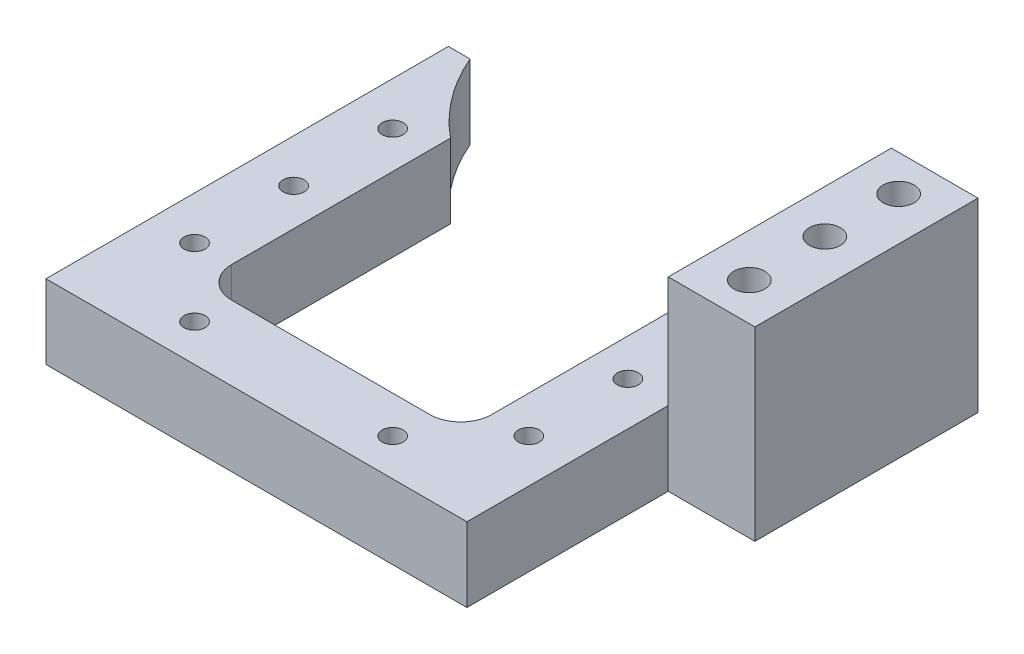
ISO-10303-21;
HEADER;
FILE_DESCRIPTION(('STEP AP214'),'2;1');
FILE_NAME('part.step','',(''),(''),'','','');
FILE_SCHEMA(('AUTOMOTIVE_DESIGN { 1 0 10303 214 1 1 1 1 }'));
ENDSEC;
DATA;
#1=APPLICATION_CONTEXT('core data for automotive mechanical design processes');
#2=APPLICATION_PROTOCOL_DEFINITION('international standard','automotive_design',2000,#1);
#3=PRODUCT_CONTEXT('',#1,'mechanical');
#4=PRODUCT('Part','Part','',(#3));
#5=PRODUCT_RELATED_PRODUCT_CATEGORY('part','',(#4));
#6=PRODUCT_DEFINITION_FORMATION('','',#4);
#7=PRODUCT_DEFINITION_CONTEXT('part definition',#1,'design');
#8=PRODUCT_DEFINITION('design','',#6,#7);
#9=PRODUCT_DEFINITION_SHAPE('','',#8);
#10=(LENGTH_UNIT() NAMED_UNIT(*) SI_UNIT(.MILLI.,.METRE.));
#11=(NAMED_UNIT(*) PLANE_ANGLE_UNIT() SI_UNIT($,.RADIAN.));
#12=(NAMED_UNIT(*) SI_UNIT($,.STERADIAN.) SOLID_ANGLE_UNIT());
#13=UNCERTAINTY_MEASURE_WITH_UNIT(LENGTH_MEASURE(1.E-05),#10,'distance_accuracy_value','');
#14=(GEOMETRIC_REPRESENTATION_CONTEXT(3) GLOBAL_UNCERTAINTY_ASSIGNED_CONTEXT((#13)) GLOBAL_UNIT_ASSIGNED_CONTEXT((#10,
#11,#12)) REPRESENTATION_CONTEXT('',''));
#15=CARTESIAN_POINT('',(0.,0.,0.));
#16=DIRECTION('',(0.,0.,1.));
#17=DIRECTION('',(1.,0.,0.));
#18=AXIS2_PLACEMENT_3D('',#15,#16,#17);
#19=CARTESIAN_POINT('',(17.,6.,6.5));
#20=DIRECTION('',(-1.,0.,0.));
#21=DIRECTION('',(0.,0.,1.));
#22=AXIS2_PLACEMENT_3D('',#19,#20,#21);
#23=PLANE('',#22);
#24=DIRECTION('',(0.,-1.,0.));
#25=VECTOR('',#24,1.);
#26=CARTESIAN_POINT('',(17.,15.,22.74));
#27=LINE('',#26,#25);
#28=CARTESIAN_POINT('',(17.,6.,22.74));
#29=VERTEX_POINT('',#28);
#30=CARTESIAN_POINT('',(17.,0.,22.74));
#31=VERTEX_POINT('',#30);
#32=EDGE_CURVE('E11',#29,#31,#27,.T.);
#33=ORIENTED_EDGE('',*,*,#32,.F.);
#34=DIRECTION('',(0.,0.,-1.));
#35=VECTOR('',#34,1.);
#36=CARTESIAN_POINT('',(17.,6.,33.5));
#37=LINE('',#36,#35);
#38=CARTESIAN_POINT('',(17.,6.,39.));
#39=VERTEX_POINT('',#38);
#40=EDGE_CURVE('E165',#39,#29,#37,.T.);
#41=ORIENTED_EDGE('',*,*,#40,.F.);
#42=DIRECTION('',(0.,-1.,0.));
#43=VECTOR('',#42,1.);
#44=CARTESIAN_POINT('',(17.,6.,39.));
#45=LINE('',#44,#43);
#46=CARTESIAN_POINT('',(17.,0.,39.));
#47=VERTEX_POINT('',#46);
#48=EDGE_CURVE('E318',#39,#47,#45,.T.);
#49=ORIENTED_EDGE('',*,*,#48,.T.);
#50=DIRECTION('',(0.,0.,-1.));
#51=VECTOR('',#50,1.);
#52=CARTESIAN_POINT('',(17.,0.,6.5));
#53=LINE('',#52,#51);
#54=EDGE_CURVE('E243',#47,#31,#53,.T.);
#55=ORIENTED_EDGE('',*,*,#54,.T.);
#56=EDGE_LOOP('',(#33,#41,#49,#55));
#57=FACE_BOUND('',#56,.T.);
#58=ADVANCED_FACE('F33',(#57),#23,.F.);
#59=CARTESIAN_POINT('',(0.,6.,0.));
#60=DIRECTION('',(0.,1.,0.));
#61=DIRECTION('',(0.,0.,1.));
#62=AXIS2_PLACEMENT_3D('',#59,#60,#61);
#63=PLANE('',#62);
#64=CARTESIAN_POINT('',(-8.,6.,30.5));
#65=DIRECTION('',(0.,1.,0.));
#66=DIRECTION('',(0.,0.,1.));
#67=AXIS2_PLACEMENT_3D('',#64,#65,#66);
#68=CIRCLE('',#67,2.49999999999999);
#69=CARTESIAN_POINT('',(-10.5,6.,30.5));
#70=VERTEX_POINT('',#69);
#71=CARTESIAN_POINT('',(-8.,6.,33.));
#72=VERTEX_POINT('',#71);
#73=EDGE_CURVE('E190',#70,#72,#68,.T.);
#74=ORIENTED_EDGE('',*,*,#73,.F.);
#75=DIRECTION('',(0.,0.,-1.));
#76=VECTOR('',#75,1.);
#77=CARTESIAN_POINT('',(-10.5,6.,12.8281916106675));
#78=LINE('',#77,#76);
#79=CARTESIAN_POINT('',(-10.5,6.,12.8281916106675));
#80=VERTEX_POINT('',#79);
#81=EDGE_CURVE('E371',#70,#80,#78,.T.);
#82=ORIENTED_EDGE('',*,*,#81,.T.);
#83=CARTESIAN_POINT('',(0.,6.,0.));
#84=DIRECTION('',(0.,-1.,0.));
#85=DIRECTION('',(0.,0.,1.));
#86=AXIS2_PLACEMENT_3D('',#83,#84,#85);
#87=CIRCLE('',#86,16.5774696501004);
#88=CARTESIAN_POINT('',(-15.25,6.,6.5));
#89=VERTEX_POINT('',#88);
#90=EDGE_CURVE('E341',#80,#89,#87,.T.);
#91=ORIENTED_EDGE('',*,*,#90,.T.);
#92=DIRECTION('',(-1.,0.,0.));
#93=VECTOR('',#92,1.);
#94=CARTESIAN_POINT('',(-17.,6.,6.5));
#95=LINE('',#94,#93);
#96=CARTESIAN_POINT('',(-17.,6.,6.5));
#97=VERTEX_POINT('',#96);
#98=EDGE_CURVE('E336',#89,#97,#95,.T.);
#99=ORIENTED_EDGE('',*,*,#98,.T.);
#100=DIRECTION('',(0.,0.,1.));
#101=VECTOR('',#100,1.);
#102=CARTESIAN_POINT('',(-17.,6.,6.5));
#103=LINE('',#102,#101);
#104=CARTESIAN_POINT('',(-17.,6.,39.));
#105=VERTEX_POINT('',#104);
#106=EDGE_CURVE('E387',#97,#105,#103,.T.);
#107=ORIENTED_EDGE('',*,*,#106,.T.);
#108=DIRECTION('',(1.,0.,0.));
#109=VECTOR('',#108,1.);
#110=CARTESIAN_POINT('',(-17.,6.,39.));
#111=LINE('',#110,#109);
#112=EDGE_CURVE('E168',#105,#39,#111,.T.);
#113=ORIENTED_EDGE('',*,*,#112,.T.);
#114=ORIENTED_EDGE('',*,*,#40,.T.);
#115=CARTESIAN_POINT('',(17.,6.,4.72231154390292));
#116=VERTEX_POINT('',#115);
#117=EDGE_CURVE('E159',#29,#116,#37,.T.);
#118=ORIENTED_EDGE('',*,*,#117,.T.);
#119=DIRECTION('',(-1.,0.,0.));
#120=VECTOR('',#119,1.);
#121=CARTESIAN_POINT('',(17.,6.,4.72231154390292));
#122=LINE('',#121,#120);
#123=CARTESIAN_POINT('',(15.25,6.,4.72231154390292));
#124=VERTEX_POINT('',#123);
#125=EDGE_CURVE('E164',#116,#124,#122,.T.);
#126=ORIENTED_EDGE('',*,*,#125,.T.);
#127=DIRECTION('',(0.,0.,1.));
#128=VECTOR('',#127,1.);
#129=CARTESIAN_POINT('',(15.25,6.,4.72231154390292));
#130=LINE('',#129,#128);
#131=CARTESIAN_POINT('',(15.25,6.,6.5));
#132=VERTEX_POINT('',#131);
#133=EDGE_CURVE('E174',#124,#132,#130,.T.);
#134=ORIENTED_EDGE('',*,*,#133,.T.);
#135=CARTESIAN_POINT('',(0.,6.,0.));
#136=DIRECTION('',(0.,-1.,0.));
#137=DIRECTION('',(0.,0.,-1.));
#138=AXIS2_PLACEMENT_3D('',#135,#136,#137);
#139=CIRCLE('',#138,16.5774696501004);
#140=CARTESIAN_POINT('',(10.5,6.,12.8281916106675));
#141=VERTEX_POINT('',#140);
#142=EDGE_CURVE('E360',#132,#141,#139,.T.);
#143=ORIENTED_EDGE('',*,*,#142,.T.);
#144=DIRECTION('',(0.,0.,1.));
#145=VECTOR('',#144,1.);
#146=CARTESIAN_POINT('',(10.5,6.,12.8281916106675));
#147=LINE('',#146,#145);
#148=CARTESIAN_POINT('',(10.5,6.,30.5));
#149=VERTEX_POINT('',#148);
#150=EDGE_CURVE('E361',#141,#149,#147,.T.);
#151=ORIENTED_EDGE('',*,*,#150,.T.);
#152=CARTESIAN_POINT('',(8.,6.,30.5));
#153=DIRECTION('',(0.,1.,0.));
#154=DIRECTION('',(0.,0.,1.));
#155=AXIS2_PLACEMENT_3D('',#152,#153,#154);
#156=CIRCLE('',#155,2.49999999999999);
#157=CARTESIAN_POINT('',(8.,6.,33.));
#158=VERTEX_POINT('',#157);
#159=EDGE_CURVE('E192',#158,#149,#156,.T.);
#160=ORIENTED_EDGE('',*,*,#159,.F.);
#161=DIRECTION('',(-1.,0.,0.));
#162=VECTOR('',#161,1.);
#163=CARTESIAN_POINT('',(8.,6.,33.));
#164=LINE('',#163,#162);
#165=EDGE_CURVE('E368',#158,#72,#164,.T.);
#166=ORIENTED_EDGE('',*,*,#165,.T.);
#167=EDGE_LOOP('',(#74,#82,#91,#99,#107,#113,#114,#118,#126,#134,#143,#151,#160,#166));
#168=FACE_BOUND('',#167,.T.);
#169=CARTESIAN_POINT('',(13.5,6.,22.5));
#170=DIRECTION('',(0.,1.,0.));
#171=DIRECTION('',(0.,0.,1.));
#172=AXIS2_PLACEMENT_3D('',#169,#170,#171);
#173=CIRCLE('',#172,0.85);
#174=CARTESIAN_POINT('',(13.5,6.,23.35));
#175=VERTEX_POINT('',#174);
#176=EDGE_CURVE('E482',#175,#175,#173,.T.);
#177=ORIENTED_EDGE('',*,*,#176,.F.);
#178=EDGE_LOOP('',(#177));
#179=FACE_BOUND('',#178,.T.);
#180=CARTESIAN_POINT('',(8.,6.,36.));
#181=DIRECTION('',(0.,1.,0.));
#182=DIRECTION('',(0.,0.,1.));
#183=AXIS2_PLACEMENT_3D('',#180,#181,#182);
#184=CIRCLE('',#183,0.850000000000001);
#185=CARTESIAN_POINT('',(8.,6.,36.85));
#186=VERTEX_POINT('',#185);
#187=EDGE_CURVE('E490',#186,#186,#184,.T.);
#188=ORIENTED_EDGE('',*,*,#187,.F.);
#189=EDGE_LOOP('',(#188));
#190=FACE_BOUND('',#189,.T.);
#191=CARTESIAN_POINT('',(-13.5,6.,14.5));
#192=DIRECTION('',(0.,1.,0.));
#193=DIRECTION('',(0.,0.,1.));
#194=AXIS2_PLACEMENT_3D('',#191,#192,#193);
#195=CIRCLE('',#194,0.85);
#196=CARTESIAN_POINT('',(-13.5,6.,15.35));
#197=VERTEX_POINT('',#196);
#198=EDGE_CURVE('E498',#197,#197,#195,.T.);
#199=ORIENTED_EDGE('',*,*,#198,.F.);
#200=EDGE_LOOP('',(#199));
#201=FACE_BOUND('',#200,.T.);
#202=CARTESIAN_POINT('',(-13.5,6.,30.5));
#203=DIRECTION('',(0.,1.,0.));
#204=DIRECTION('',(0.,0.,1.));
#205=AXIS2_PLACEMENT_3D('',#202,#203,#204);
#206=CIRCLE('',#205,0.85);
#207=CARTESIAN_POINT('',(-13.5,6.,31.35));
#208=VERTEX_POINT('',#207);
#209=EDGE_CURVE('E373',#208,#208,#206,.T.);
#210=ORIENTED_EDGE('',*,*,#209,.F.);
#211=EDGE_LOOP('',(#210));
#212=FACE_BOUND('',#211,.T.);
#213=CARTESIAN_POINT('',(-13.5,6.,22.5));
#214=DIRECTION('',(0.,1.,0.));
#215=DIRECTION('',(0.,0.,1.));
#216=AXIS2_PLACEMENT_3D('',#213,#214,#215);
#217=CIRCLE('',#216,0.85);
#218=CARTESIAN_POINT('',(-13.5,6.,23.35));
#219=VERTEX_POINT('',#218);
#220=EDGE_CURVE('E380',#219,#219,#217,.T.);
#221=ORIENTED_EDGE('',*,*,#220,.F.);
#222=EDGE_LOOP('',(#221));
#223=FACE_BOUND('',#222,.T.);
#224=CARTESIAN_POINT('',(-8.,6.,36.));
#225=DIRECTION('',(0.,1.,0.));
#226=DIRECTION('',(0.,0.,1.));
#227=AXIS2_PLACEMENT_3D('',#224,#225,#226);
#228=CIRCLE('',#227,0.850000000000002);
#229=CARTESIAN_POINT('',(-8.,6.,36.85));
#230=VERTEX_POINT('',#229);
#231=EDGE_CURVE('E494',#230,#230,#228,.T.);
#232=ORIENTED_EDGE('',*,*,#231,.F.);
#233=EDGE_LOOP('',(#232));
#234=FACE_BOUND('',#233,.T.);
#235=CARTESIAN_POINT('',(13.5,6.,30.5));
#236=DIRECTION('',(0.,1.,0.));
#237=DIRECTION('',(0.,0.,1.));
#238=AXIS2_PLACEMENT_3D('',#235,#236,#237);
#239=CIRCLE('',#238,0.85);
#240=CARTESIAN_POINT('',(13.5,6.,31.35));
#241=VERTEX_POINT('',#240);
#242=EDGE_CURVE('E486',#241,#241,#239,.T.);
#243=ORIENTED_EDGE('',*,*,#242,.F.);
#244=EDGE_LOOP('',(#243));
#245=FACE_BOUND('',#244,.T.);
#246=CARTESIAN_POINT('',(13.5,6.,14.5));
#247=DIRECTION('',(0.,1.,0.));
#248=DIRECTION('',(0.,0.,1.));
#249=AXIS2_PLACEMENT_3D('',#246,#247,#248);
#250=CIRCLE('',#249,0.85);
#251=CARTESIAN_POINT('',(13.5,6.,15.35));
#252=VERTEX_POINT('',#251);
#253=EDGE_CURVE('E478',#252,#252,#250,.T.);
#254=ORIENTED_EDGE('',*,*,#253,.F.);
#255=EDGE_LOOP('',(#254));
#256=FACE_BOUND('',#255,.T.);
#257=ADVANCED_FACE('F161',(#168,#179,#190,#201,#212,#223,#234,#245,#256),#63,.T.);
#258=CARTESIAN_POINT('',(0.,0.,0.));
#259=DIRECTION('',(0.,1.,0.));
#260=DIRECTION('',(0.,0.,1.));
#261=AXIS2_PLACEMENT_3D('',#258,#259,#260);
#262=PLANE('',#261);
#263=CARTESIAN_POINT('',(0.,0.,0.));
#264=DIRECTION('',(0.,-1.,0.));
#265=DIRECTION('',(0.,0.,-1.));
#266=AXIS2_PLACEMENT_3D('',#263,#264,#265);
#267=CIRCLE('',#266,16.5774696501004);
#268=CARTESIAN_POINT('',(15.25,0.,6.5));
#269=VERTEX_POINT('',#268);
#270=CARTESIAN_POINT('',(10.5,0.,12.8281916106675));
#271=VERTEX_POINT('',#270);
#272=EDGE_CURVE('E321',#269,#271,#267,.T.);
#273=ORIENTED_EDGE('',*,*,#272,.F.);
#274=DIRECTION('',(0.,0.,-1.));
#275=VECTOR('',#274,1.);
#276=CARTESIAN_POINT('',(15.25,0.,4.72231154390292));
#277=LINE('',#276,#275);
#278=CARTESIAN_POINT('',(15.25,0.,4.72231154390292));
#279=VERTEX_POINT('',#278);
#280=EDGE_CURVE('E180',#269,#279,#277,.T.);
#281=ORIENTED_EDGE('',*,*,#280,.T.);
#282=DIRECTION('',(1.,0.,0.));
#283=VECTOR('',#282,1.);
#284=CARTESIAN_POINT('',(17.,0.,4.72231154390292));
#285=LINE('',#284,#283);
#286=CARTESIAN_POINT('',(17.,0.,4.72231154390292));
#287=VERTEX_POINT('',#286);
#288=EDGE_CURVE('E184',#279,#287,#285,.T.);
#289=ORIENTED_EDGE('',*,*,#288,.T.);
#290=DIRECTION('',(0.,0.,-1.));
#291=VECTOR('',#290,1.);
#292=CARTESIAN_POINT('',(17.,0.,4.72));
#293=LINE('',#292,#291);
#294=CARTESIAN_POINT('',(17.,0.,4.72));
#295=VERTEX_POINT('',#294);
#296=EDGE_CURVE('E37',#287,#295,#293,.T.);
#297=ORIENTED_EDGE('',*,*,#296,.T.);
#298=DIRECTION('',(1.,0.,0.));
#299=VECTOR('',#298,1.);
#300=CARTESIAN_POINT('',(24.,0.,4.72));
#301=LINE('',#300,#299);
#302=CARTESIAN_POINT('',(24.,0.,4.72));
#303=VERTEX_POINT('',#302);
#304=EDGE_CURVE('E217',#295,#303,#301,.T.);
#305=ORIENTED_EDGE('',*,*,#304,.T.);
#306=DIRECTION('',(0.,0.,1.));
#307=VECTOR('',#306,1.);
#308=CARTESIAN_POINT('',(24.,0.,22.74));
#309=LINE('',#308,#307);
#310=CARTESIAN_POINT('',(24.,0.,22.74));
#311=VERTEX_POINT('',#310);
#312=EDGE_CURVE('E210',#303,#311,#309,.T.);
#313=ORIENTED_EDGE('',*,*,#312,.T.);
#314=DIRECTION('',(-1.,0.,0.));
#315=VECTOR('',#314,1.);
#316=CARTESIAN_POINT('',(17.,0.,22.74));
#317=LINE('',#316,#315);
#318=EDGE_CURVE('E227',#311,#31,#317,.T.);
#319=ORIENTED_EDGE('',*,*,#318,.T.);
#320=ORIENTED_EDGE('',*,*,#54,.F.);
#321=DIRECTION('',(1.,0.,0.));
#322=VECTOR('',#321,1.);
#323=CARTESIAN_POINT('',(-17.,0.,39.));
#324=LINE('',#323,#322);
#325=CARTESIAN_POINT('',(-17.,0.,39.));
#326=VERTEX_POINT('',#325);
#327=EDGE_CURVE('E312',#326,#47,#324,.T.);
#328=ORIENTED_EDGE('',*,*,#327,.F.);
#329=DIRECTION('',(0.,0.,1.));
#330=VECTOR('',#329,1.);
#331=CARTESIAN_POINT('',(-17.,0.,33.5));
#332=LINE('',#331,#330);
#333=CARTESIAN_POINT('',(-17.,0.,6.5));
#334=VERTEX_POINT('',#333);
#335=EDGE_CURVE('E304',#334,#326,#332,.T.);
#336=ORIENTED_EDGE('',*,*,#335,.F.);
#337=DIRECTION('',(-1.,0.,0.));
#338=VECTOR('',#337,1.);
#339=CARTESIAN_POINT('',(-17.,0.,6.5));
#340=LINE('',#339,#338);
#341=CARTESIAN_POINT('',(-15.25,0.,6.5));
#342=VERTEX_POINT('',#341);
#343=EDGE_CURVE('E313',#342,#334,#340,.T.);
#344=ORIENTED_EDGE('',*,*,#343,.F.);
#345=CARTESIAN_POINT('',(0.,0.,0.));
#346=DIRECTION('',(0.,-1.,0.));
#347=DIRECTION('',(0.,0.,1.));
#348=AXIS2_PLACEMENT_3D('',#345,#346,#347);
#349=CIRCLE('',#348,16.5774696501004);
#350=CARTESIAN_POINT('',(-10.5,0.,12.8281916106675));
#351=VERTEX_POINT('',#350);
#352=EDGE_CURVE('E334',#351,#342,#349,.T.);
#353=ORIENTED_EDGE('',*,*,#352,.F.);
#354=DIRECTION('',(0.,0.,-1.));
#355=VECTOR('',#354,1.);
#356=CARTESIAN_POINT('',(-10.5,0.,12.8281916106675));
#357=LINE('',#356,#355);
#358=CARTESIAN_POINT('',(-10.5,0.,30.5));
#359=VERTEX_POINT('',#358);
#360=EDGE_CURVE('E332',#359,#351,#357,.T.);
#361=ORIENTED_EDGE('',*,*,#360,.F.);
#362=CARTESIAN_POINT('',(-8.,0.,30.5));
#363=DIRECTION('',(0.,-1.,0.));
#364=DIRECTION('',(0.,0.,-1.));
#365=AXIS2_PLACEMENT_3D('',#362,#363,#364);
#366=CIRCLE('',#365,2.49999999999999);
#367=CARTESIAN_POINT('',(-8.,0.,33.));
#368=VERTEX_POINT('',#367);
#369=EDGE_CURVE('E186',#368,#359,#366,.T.);
#370=ORIENTED_EDGE('',*,*,#369,.F.);
#371=DIRECTION('',(-1.,0.,0.));
#372=VECTOR('',#371,1.);
#373=CARTESIAN_POINT('',(8.,0.,33.));
#374=LINE('',#373,#372);
#375=CARTESIAN_POINT('',(8.,0.,33.));
#376=VERTEX_POINT('',#375);
#377=EDGE_CURVE('E329',#376,#368,#374,.T.);
#378=ORIENTED_EDGE('',*,*,#377,.F.);
#379=CARTESIAN_POINT('',(8.,0.,30.5));
#380=DIRECTION('',(0.,-1.,0.));
#381=DIRECTION('',(0.,0.,-1.));
#382=AXIS2_PLACEMENT_3D('',#379,#380,#381);
#383=CIRCLE('',#382,2.49999999999999);
#384=CARTESIAN_POINT('',(10.5,0.,30.5));
#385=VERTEX_POINT('',#384);
#386=EDGE_CURVE('E188',#385,#376,#383,.T.);
#387=ORIENTED_EDGE('',*,*,#386,.F.);
#388=DIRECTION('',(0.,0.,1.));
#389=VECTOR('',#388,1.);
#390=CARTESIAN_POINT('',(10.5,0.,12.8281916106675));
#391=LINE('',#390,#389);
#392=EDGE_CURVE('E326',#271,#385,#391,.T.);
#393=ORIENTED_EDGE('',*,*,#392,.F.);
#394=EDGE_LOOP('',(#273,#281,#289,#297,#305,#313,#319,#320,#328,#336,#344,#353,#361,#370,#378,
#387,#393));
#395=FACE_BOUND('',#394,.T.);
#396=CARTESIAN_POINT('',(20.5,0.,19.69));
#397=DIRECTION('',(0.,-1.,0.));
#398=DIRECTION('',(0.,0.,-1.));
#399=AXIS2_PLACEMENT_3D('',#396,#397,#398);
#400=CIRCLE('',#399,1.25);
#401=CARTESIAN_POINT('',(20.5,0.,18.44));
#402=VERTEX_POINT('',#401);
#403=EDGE_CURVE('E194',#402,#402,#400,.T.);
#404=ORIENTED_EDGE('',*,*,#403,.F.);
#405=EDGE_LOOP('',(#404));
#406=FACE_BOUND('',#405,.T.);
#407=CARTESIAN_POINT('',(20.5,0.,13.59));
#408=DIRECTION('',(0.,-1.,0.));
#409=DIRECTION('',(0.,0.,-1.));
#410=AXIS2_PLACEMENT_3D('',#407,#408,#409);
#411=CIRCLE('',#410,1.25);
#412=CARTESIAN_POINT('',(20.5,0.,12.34));
#413=VERTEX_POINT('',#412);
#414=EDGE_CURVE('E198',#413,#413,#411,.T.);
#415=ORIENTED_EDGE('',*,*,#414,.F.);
#416=EDGE_LOOP('',(#415));
#417=FACE_BOUND('',#416,.T.);
#418=CARTESIAN_POINT('',(20.5,0.,7.63));
#419=DIRECTION('',(0.,-1.,0.));
#420=DIRECTION('',(0.,0.,-1.));
#421=AXIS2_PLACEMENT_3D('',#418,#419,#420);
#422=CIRCLE('',#421,1.25);
#423=CARTESIAN_POINT('',(20.5,0.,6.38));
#424=VERTEX_POINT('',#423);
#425=EDGE_CURVE('E204',#424,#424,#422,.T.);
#426=ORIENTED_EDGE('',*,*,#425,.F.);
#427=EDGE_LOOP('',(#426));
#428=FACE_BOUND('',#427,.T.);
#429=CARTESIAN_POINT('',(-13.5,0.,30.5));
#430=DIRECTION('',(0.,1.,0.));
#431=DIRECTION('',(0.,0.,1.));
#432=AXIS2_PLACEMENT_3D('',#429,#430,#431);
#433=CIRCLE('',#432,0.85);
#434=CARTESIAN_POINT('',(-13.5,0.,31.35));
#435=VERTEX_POINT('',#434);
#436=EDGE_CURVE('E375',#435,#435,#433,.T.);
#437=ORIENTED_EDGE('',*,*,#436,.T.);
#438=EDGE_LOOP('',(#437));
#439=FACE_BOUND('',#438,.T.);
#440=CARTESIAN_POINT('',(-13.5,0.,22.5));
#441=DIRECTION('',(0.,1.,0.));
#442=DIRECTION('',(0.,0.,1.));
#443=AXIS2_PLACEMENT_3D('',#440,#441,#442);
#444=CIRCLE('',#443,0.85);
#445=CARTESIAN_POINT('',(-13.5,0.,23.35));
#446=VERTEX_POINT('',#445);
#447=EDGE_CURVE('E383',#446,#446,#444,.T.);
#448=ORIENTED_EDGE('',*,*,#447,.T.);
#449=EDGE_LOOP('',(#448));
#450=FACE_BOUND('',#449,.T.);
#451=CARTESIAN_POINT('',(-13.5,0.,14.5));
#452=DIRECTION('',(0.,1.,0.));
#453=DIRECTION('',(0.,0.,1.));
#454=AXIS2_PLACEMENT_3D('',#451,#452,#453);
#455=CIRCLE('',#454,0.85);
#456=CARTESIAN_POINT('',(-13.5,0.,15.35));
#457=VERTEX_POINT('',#456);
#458=EDGE_CURVE('E458',#457,#457,#455,.T.);
#459=ORIENTED_EDGE('',*,*,#458,.T.);
#460=EDGE_LOOP('',(#459));
#461=FACE_BOUND('',#460,.T.);
#462=CARTESIAN_POINT('',(-8.,0.,36.));
#463=DIRECTION('',(0.,1.,0.));
#464=DIRECTION('',(0.,0.,1.));
#465=AXIS2_PLACEMENT_3D('',#462,#463,#464);
#466=CIRCLE('',#465,0.850000000000002);
#467=CARTESIAN_POINT('',(-8.,0.,36.85));
#468=VERTEX_POINT('',#467);
#469=EDGE_CURVE('E462',#468,#468,#466,.T.);
#470=ORIENTED_EDGE('',*,*,#469,.T.);
#471=EDGE_LOOP('',(#470));
#472=FACE_BOUND('',#471,.T.);
#473=CARTESIAN_POINT('',(8.,0.,36.));
#474=DIRECTION('',(0.,1.,0.));
#475=DIRECTION('',(0.,0.,1.));
#476=AXIS2_PLACEMENT_3D('',#473,#474,#475);
#477=CIRCLE('',#476,0.850000000000001);
#478=CARTESIAN_POINT('',(8.,0.,36.85));
#479=VERTEX_POINT('',#478);
#480=EDGE_CURVE('E466',#479,#479,#477,.T.);
#481=ORIENTED_EDGE('',*,*,#480,.T.);
#482=EDGE_LOOP('',(#481));
#483=FACE_BOUND('',#482,.T.);
#484=CARTESIAN_POINT('',(13.5,0.,30.5));
#485=DIRECTION('',(0.,1.,0.));
#486=DIRECTION('',(0.,0.,1.));
#487=AXIS2_PLACEMENT_3D('',#484,#485,#486);
#488=CIRCLE('',#487,0.85);
#489=CARTESIAN_POINT('',(13.5,0.,31.35));
#490=VERTEX_POINT('',#489);
#491=EDGE_CURVE('E470',#490,#490,#488,.T.);
#492=ORIENTED_EDGE('',*,*,#491,.T.);
#493=EDGE_LOOP('',(#492));
#494=FACE_BOUND('',#493,.T.);
#495=CARTESIAN_POINT('',(13.5,0.,22.5));
#496=DIRECTION('',(0.,1.,0.));
#497=DIRECTION('',(0.,0.,1.));
#498=AXIS2_PLACEMENT_3D('',#495,#496,#497);
#499=CIRCLE('',#498,0.85);
#500=CARTESIAN_POINT('',(13.5,0.,23.35));
#501=VERTEX_POINT('',#500);
#502=EDGE_CURVE('E474',#501,#501,#499,.T.);
#503=ORIENTED_EDGE('',*,*,#502,.T.);
#504=EDGE_LOOP('',(#503));
#505=FACE_BOUND('',#504,.T.);
#506=CARTESIAN_POINT('',(13.5,0.,14.5));
#507=DIRECTION('',(0.,1.,0.));
#508=DIRECTION('',(0.,0.,1.));
#509=AXIS2_PLACEMENT_3D('',#506,#507,#508);
#510=CIRCLE('',#509,0.85);
#511=CARTESIAN_POINT('',(13.5,0.,15.35));
#512=VERTEX_POINT('',#511);
#513=EDGE_CURVE('E234',#512,#512,#510,.T.);
#514=ORIENTED_EDGE('',*,*,#513,.T.);
#515=EDGE_LOOP('',(#514));
#516=FACE_BOUND('',#515,.T.);
#517=ADVANCED_FACE('F251',(#395,#406,#417,#428,#439,#450,#461,#472,#483,#494,#505,#516),#262,.F.);
#518=CARTESIAN_POINT('',(-17.,6.,6.5));
#519=DIRECTION('',(0.,0.,1.));
#520=DIRECTION('',(1.,0.,0.));
#521=AXIS2_PLACEMENT_3D('',#518,#519,#520);
#522=PLANE('',#521);
#523=ORIENTED_EDGE('',*,*,#343,.T.);
#524=DIRECTION('',(0.,-1.,0.));
#525=VECTOR('',#524,1.);
#526=CARTESIAN_POINT('',(-17.,6.,6.5));
#527=LINE('',#526,#525);
#528=EDGE_CURVE('E43',#97,#334,#527,.T.);
#529=ORIENTED_EDGE('',*,*,#528,.F.);
#530=ORIENTED_EDGE('',*,*,#98,.F.);
#531=DIRECTION('',(0.,-1.,0.));
#532=VECTOR('',#531,1.);
#533=CARTESIAN_POINT('',(-15.25,6.,6.5));
#534=LINE('',#533,#532);
#535=EDGE_CURVE('E337',#89,#342,#534,.T.);
#536=ORIENTED_EDGE('',*,*,#535,.T.);
#537=EDGE_LOOP('',(#523,#529,#530,#536));
#538=FACE_BOUND('',#537,.T.);
#539=ADVANCED_FACE('F35',(#538),#522,.F.);
#540=CARTESIAN_POINT('',(-17.,6.,33.5));
#541=DIRECTION('',(1.,0.,0.));
#542=DIRECTION('',(0.,0.,-1.));
#543=AXIS2_PLACEMENT_3D('',#540,#541,#542);
#544=PLANE('',#543);
#545=ORIENTED_EDGE('',*,*,#335,.T.);
#546=DIRECTION('',(0.,-1.,0.));
#547=VECTOR('',#546,1.);
#548=CARTESIAN_POINT('',(-17.,6.,39.));
#549=LINE('',#548,#547);
#550=EDGE_CURVE('E306',#105,#326,#549,.T.);
#551=ORIENTED_EDGE('',*,*,#550,.F.);
#552=ORIENTED_EDGE('',*,*,#106,.F.);
#553=ORIENTED_EDGE('',*,*,#528,.T.);
#554=EDGE_LOOP('',(#545,#551,#552,#553));
#555=FACE_BOUND('',#554,.T.);
#556=ADVANCED_FACE('F294',(#555),#544,.F.);
#557=CARTESIAN_POINT('',(-17.,6.,39.));
#558=DIRECTION('',(0.,0.,-1.));
#559=DIRECTION('',(-1.,0.,0.));
#560=AXIS2_PLACEMENT_3D('',#557,#558,#559);
#561=PLANE('',#560);
#562=ORIENTED_EDGE('',*,*,#327,.T.);
#563=ORIENTED_EDGE('',*,*,#48,.F.);
#564=ORIENTED_EDGE('',*,*,#112,.F.);
#565=ORIENTED_EDGE('',*,*,#550,.T.);
#566=EDGE_LOOP('',(#562,#563,#564,#565));
#567=FACE_BOUND('',#566,.T.);
#568=ADVANCED_FACE('F292',(#567),#561,.F.);
#569=CARTESIAN_POINT('',(0.,6.,0.));
#570=DIRECTION('',(0.,-1.,0.));
#571=DIRECTION('',(0.,0.,-1.));
#572=AXIS2_PLACEMENT_3D('',#569,#570,#571);
#573=CYLINDRICAL_SURFACE('',#572,16.5774696501004);
#574=ORIENTED_EDGE('',*,*,#272,.T.);
#575=DIRECTION('',(0.,-1.,0.));
#576=VECTOR('',#575,1.);
#577=CARTESIAN_POINT('',(10.5,6.,12.8281916106675));
#578=LINE('',#577,#576);
#579=EDGE_CURVE('E354',#141,#271,#578,.T.);
#580=ORIENTED_EDGE('',*,*,#579,.F.);
#581=ORIENTED_EDGE('',*,*,#142,.F.);
#582=DIRECTION('',(0.,-1.,0.));
#583=VECTOR('',#582,1.);
#584=CARTESIAN_POINT('',(15.25,6.,6.5));
#585=LINE('',#584,#583);
#586=EDGE_CURVE('E357',#132,#269,#585,.T.);
#587=ORIENTED_EDGE('',*,*,#586,.T.);
#588=EDGE_LOOP('',(#574,#580,#581,#587));
#589=FACE_BOUND('',#588,.T.);
#590=ADVANCED_FACE('F290',(#589),#573,.F.);
#591=CARTESIAN_POINT('',(10.5,6.,12.8281916106675));
#592=DIRECTION('',(1.,0.,0.));
#593=DIRECTION('',(0.,0.,-1.));
#594=AXIS2_PLACEMENT_3D('',#591,#592,#593);
#595=PLANE('',#594);
#596=ORIENTED_EDGE('',*,*,#392,.T.);
#597=DIRECTION('',(0.,-1.,0.));
#598=VECTOR('',#597,1.);
#599=CARTESIAN_POINT('',(10.5,6.,30.5));
#600=LINE('',#599,#598);
#601=EDGE_CURVE('E352',#149,#385,#600,.T.);
#602=ORIENTED_EDGE('',*,*,#601,.F.);
#603=ORIENTED_EDGE('',*,*,#150,.F.);
#604=ORIENTED_EDGE('',*,*,#579,.T.);
#605=EDGE_LOOP('',(#596,#602,#603,#604));
#606=FACE_BOUND('',#605,.T.);
#607=ADVANCED_FACE('F413',(#606),#595,.F.);
#608=CARTESIAN_POINT('',(8.,6.,33.));
#609=DIRECTION('',(0.,0.,1.));
#610=DIRECTION('',(1.,0.,0.));
#611=AXIS2_PLACEMENT_3D('',#608,#609,#610);
#612=PLANE('',#611);
#613=ORIENTED_EDGE('',*,*,#377,.T.);
#614=DIRECTION('',(0.,-1.,0.));
#615=VECTOR('',#614,1.);
#616=CARTESIAN_POINT('',(-8.,6.,33.));
#617=LINE('',#616,#615);
#618=EDGE_CURVE('E347',#72,#368,#617,.T.);
#619=ORIENTED_EDGE('',*,*,#618,.F.);
#620=ORIENTED_EDGE('',*,*,#165,.F.);
#621=DIRECTION('',(0.,-1.,0.));
#622=VECTOR('',#621,1.);
#623=CARTESIAN_POINT('',(8.,6.,33.));
#624=LINE('',#623,#622);
#625=EDGE_CURVE('E349',#158,#376,#624,.T.);
#626=ORIENTED_EDGE('',*,*,#625,.T.);
#627=EDGE_LOOP('',(#613,#619,#620,#626));
#628=FACE_BOUND('',#627,.T.);
#629=ADVANCED_FACE('F406',(#628),#612,.F.);
#630=CARTESIAN_POINT('',(-10.5,6.,12.8281916106675));
#631=DIRECTION('',(-1.,0.,0.));
#632=DIRECTION('',(0.,0.,1.));
#633=AXIS2_PLACEMENT_3D('',#630,#631,#632);
#634=PLANE('',#633);
#635=ORIENTED_EDGE('',*,*,#360,.T.);
#636=DIRECTION('',(0.,-1.,0.));
#637=VECTOR('',#636,1.);
#638=CARTESIAN_POINT('',(-10.5,6.,12.8281916106675));
#639=LINE('',#638,#637);
#640=EDGE_CURVE('E340',#80,#351,#639,.T.);
#641=ORIENTED_EDGE('',*,*,#640,.F.);
#642=ORIENTED_EDGE('',*,*,#81,.F.);
#643=DIRECTION('',(0.,-1.,0.));
#644=VECTOR('',#643,1.);
#645=CARTESIAN_POINT('',(-10.5,6.,30.5));
#646=LINE('',#645,#644);
#647=EDGE_CURVE('E344',#70,#359,#646,.T.);
#648=ORIENTED_EDGE('',*,*,#647,.T.);
#649=EDGE_LOOP('',(#635,#641,#642,#648));
#650=FACE_BOUND('',#649,.T.);
#651=ADVANCED_FACE('F399',(#650),#634,.F.);
#652=CARTESIAN_POINT('',(0.,6.,0.));
#653=DIRECTION('',(0.,-1.,0.));
#654=DIRECTION('',(0.,0.,-1.));
#655=AXIS2_PLACEMENT_3D('',#652,#653,#654);
#656=CYLINDRICAL_SURFACE('',#655,16.5774696501004);
#657=ORIENTED_EDGE('',*,*,#352,.T.);
#658=ORIENTED_EDGE('',*,*,#535,.F.);
#659=ORIENTED_EDGE('',*,*,#90,.F.);
#660=ORIENTED_EDGE('',*,*,#640,.T.);
#661=EDGE_LOOP('',(#657,#658,#659,#660));
#662=FACE_BOUND('',#661,.T.);
#663=ADVANCED_FACE('F395',(#662),#656,.F.);
#664=CARTESIAN_POINT('',(-13.5,6.,30.5));
#665=DIRECTION('',(0.,-1.,0.));
#666=DIRECTION('',(0.,0.,-1.));
#667=AXIS2_PLACEMENT_3D('',#664,#665,#666);
#668=CYLINDRICAL_SURFACE('',#667,0.85);
#669=ORIENTED_EDGE('',*,*,#209,.T.);
#670=EDGE_LOOP('',(#669));
#671=FACE_BOUND('',#670,.T.);
#672=ORIENTED_EDGE('',*,*,#436,.F.);
#673=EDGE_LOOP('',(#672));
#674=FACE_BOUND('',#673,.T.);
#675=ADVANCED_FACE('F545',(#671,#674),#668,.F.);
#676=CARTESIAN_POINT('',(-13.5,6.,22.5));
#677=DIRECTION('',(0.,-1.,0.));
#678=DIRECTION('',(0.,0.,-1.));
#679=AXIS2_PLACEMENT_3D('',#676,#677,#678);
#680=CYLINDRICAL_SURFACE('',#679,0.85);
#681=ORIENTED_EDGE('',*,*,#220,.T.);
#682=EDGE_LOOP('',(#681));
#683=FACE_BOUND('',#682,.T.);
#684=ORIENTED_EDGE('',*,*,#447,.F.);
#685=EDGE_LOOP('',(#684));
#686=FACE_BOUND('',#685,.T.);
#687=ADVANCED_FACE('F504',(#683,#686),#680,.F.);
#688=CARTESIAN_POINT('',(-13.5,6.,14.5));
#689=DIRECTION('',(0.,-1.,0.));
#690=DIRECTION('',(0.,0.,-1.));
#691=AXIS2_PLACEMENT_3D('',#688,#689,#690);
#692=CYLINDRICAL_SURFACE('',#691,0.85);
#693=ORIENTED_EDGE('',*,*,#198,.T.);
#694=EDGE_LOOP('',(#693));
#695=FACE_BOUND('',#694,.T.);
#696=ORIENTED_EDGE('',*,*,#458,.F.);
#697=EDGE_LOOP('',(#696));
#698=FACE_BOUND('',#697,.T.);
#699=ADVANCED_FACE('F538',(#695,#698),#692,.F.);
#700=CARTESIAN_POINT('',(-8.,6.,36.));
#701=DIRECTION('',(0.,-1.,0.));
#702=DIRECTION('',(0.,0.,-1.));
#703=AXIS2_PLACEMENT_3D('',#700,#701,#702);
#704=CYLINDRICAL_SURFACE('',#703,0.850000000000002);
#705=ORIENTED_EDGE('',*,*,#231,.T.);
#706=EDGE_LOOP('',(#705));
#707=FACE_BOUND('',#706,.T.);
#708=ORIENTED_EDGE('',*,*,#469,.F.);
#709=EDGE_LOOP('',(#708));
#710=FACE_BOUND('',#709,.T.);
#711=ADVANCED_FACE('F534',(#707,#710),#704,.F.);
#712=CARTESIAN_POINT('',(8.,6.,36.));
#713=DIRECTION('',(0.,-1.,0.));
#714=DIRECTION('',(0.,0.,-1.));
#715=AXIS2_PLACEMENT_3D('',#712,#713,#714);
#716=CYLINDRICAL_SURFACE('',#715,0.850000000000001);
#717=ORIENTED_EDGE('',*,*,#187,.T.);
#718=EDGE_LOOP('',(#717));
#719=FACE_BOUND('',#718,.T.);
#720=ORIENTED_EDGE('',*,*,#480,.F.);
#721=EDGE_LOOP('',(#720));
#722=FACE_BOUND('',#721,.T.);
#723=ADVANCED_FACE('F530',(#719,#722),#716,.F.);
#724=CARTESIAN_POINT('',(13.5,6.,30.5));
#725=DIRECTION('',(0.,-1.,0.));
#726=DIRECTION('',(0.,0.,-1.));
#727=AXIS2_PLACEMENT_3D('',#724,#725,#726);
#728=CYLINDRICAL_SURFACE('',#727,0.85);
#729=ORIENTED_EDGE('',*,*,#242,.T.);
#730=EDGE_LOOP('',(#729));
#731=FACE_BOUND('',#730,.T.);
#732=ORIENTED_EDGE('',*,*,#491,.F.);
#733=EDGE_LOOP('',(#732));
#734=FACE_BOUND('',#733,.T.);
#735=ADVANCED_FACE('F523',(#731,#734),#728,.F.);
#736=CARTESIAN_POINT('',(13.5,6.,22.5));
#737=DIRECTION('',(0.,-1.,0.));
#738=DIRECTION('',(0.,0.,-1.));
#739=AXIS2_PLACEMENT_3D('',#736,#737,#738);
#740=CYLINDRICAL_SURFACE('',#739,0.85);
#741=ORIENTED_EDGE('',*,*,#176,.T.);
#742=EDGE_LOOP('',(#741));
#743=FACE_BOUND('',#742,.T.);
#744=ORIENTED_EDGE('',*,*,#502,.F.);
#745=EDGE_LOOP('',(#744));
#746=FACE_BOUND('',#745,.T.);
#747=ADVANCED_FACE('F516',(#743,#746),#740,.F.);
#748=CARTESIAN_POINT('',(13.5,6.,14.5));
#749=DIRECTION('',(0.,-1.,0.));
#750=DIRECTION('',(0.,0.,-1.));
#751=AXIS2_PLACEMENT_3D('',#748,#749,#750);
#752=CYLINDRICAL_SURFACE('',#751,0.85);
#753=ORIENTED_EDGE('',*,*,#253,.T.);
#754=EDGE_LOOP('',(#753));
#755=FACE_BOUND('',#754,.T.);
#756=ORIENTED_EDGE('',*,*,#513,.F.);
#757=EDGE_LOOP('',(#756));
#758=FACE_BOUND('',#757,.T.);
#759=ADVANCED_FACE('F514',(#755,#758),#752,.F.);
#760=CARTESIAN_POINT('',(17.,15.,4.72));
#761=DIRECTION('',(-1.,0.,0.));
#762=DIRECTION('',(0.,0.,1.));
#763=AXIS2_PLACEMENT_3D('',#760,#761,#762);
#764=PLANE('',#763);
#765=DIRECTION('',(0.,1.,0.));
#766=VECTOR('',#765,1.);
#767=CARTESIAN_POINT('',(17.,-2.49452926359681,4.72231154390292));
#768=LINE('',#767,#766);
#769=EDGE_CURVE('E51',#287,#116,#768,.T.);
#770=ORIENTED_EDGE('',*,*,#769,.T.);
#771=ORIENTED_EDGE('',*,*,#117,.F.);
#772=CARTESIAN_POINT('',(17.,15.,22.74));
#773=VERTEX_POINT('',#772);
#774=EDGE_CURVE('E237',#773,#29,#27,.T.);
#775=ORIENTED_EDGE('',*,*,#774,.F.);
#776=DIRECTION('',(0.,0.,-1.));
#777=VECTOR('',#776,1.);
#778=CARTESIAN_POINT('',(17.,15.,22.74));
#779=LINE('',#778,#777);
#780=CARTESIAN_POINT('',(17.,15.,4.72));
#781=VERTEX_POINT('',#780);
#782=EDGE_CURVE('E220',#773,#781,#779,.T.);
#783=ORIENTED_EDGE('',*,*,#782,.T.);
#784=DIRECTION('',(0.,-1.,0.));
#785=VECTOR('',#784,1.);
#786=CARTESIAN_POINT('',(17.,15.,4.72));
#787=LINE('',#786,#785);
#788=EDGE_CURVE('E235',#781,#295,#787,.T.);
#789=ORIENTED_EDGE('',*,*,#788,.T.);
#790=ORIENTED_EDGE('',*,*,#296,.F.);
#791=EDGE_LOOP('',(#770,#771,#775,#783,#789,#790));
#792=FACE_BOUND('',#791,.T.);
#793=ADVANCED_FACE('F177',(#792),#764,.T.);
#794=CARTESIAN_POINT('',(24.,15.,22.74));
#795=DIRECTION('',(1.,0.,0.));
#796=DIRECTION('',(0.,0.,-1.));
#797=AXIS2_PLACEMENT_3D('',#794,#795,#796);
#798=PLANE('',#797);
#799=ORIENTED_EDGE('',*,*,#312,.F.);
#800=DIRECTION('',(0.,-1.,0.));
#801=VECTOR('',#800,1.);
#802=CARTESIAN_POINT('',(24.,15.,4.72));
#803=LINE('',#802,#801);
#804=CARTESIAN_POINT('',(24.,15.,4.72));
#805=VERTEX_POINT('',#804);
#806=EDGE_CURVE('E232',#805,#303,#803,.T.);
#807=ORIENTED_EDGE('',*,*,#806,.F.);
#808=DIRECTION('',(0.,0.,1.));
#809=VECTOR('',#808,1.);
#810=CARTESIAN_POINT('',(24.,15.,22.74));
#811=LINE('',#810,#809);
#812=CARTESIAN_POINT('',(24.,15.,22.74));
#813=VERTEX_POINT('',#812);
#814=EDGE_CURVE('E213',#805,#813,#811,.T.);
#815=ORIENTED_EDGE('',*,*,#814,.T.);
#816=DIRECTION('',(0.,-1.,0.));
#817=VECTOR('',#816,1.);
#818=CARTESIAN_POINT('',(24.,15.,22.74));
#819=LINE('',#818,#817);
#820=EDGE_CURVE('E225',#813,#311,#819,.T.);
#821=ORIENTED_EDGE('',*,*,#820,.T.);
#822=EDGE_LOOP('',(#799,#807,#815,#821));
#823=FACE_BOUND('',#822,.T.);
#824=ADVANCED_FACE('F262',(#823),#798,.T.);
#825=CARTESIAN_POINT('',(24.,15.,4.72));
#826=DIRECTION('',(0.,0.,-1.));
#827=DIRECTION('',(-1.,0.,0.));
#828=AXIS2_PLACEMENT_3D('',#825,#826,#827);
#829=PLANE('',#828);
#830=ORIENTED_EDGE('',*,*,#304,.F.);
#831=ORIENTED_EDGE('',*,*,#788,.F.);
#832=DIRECTION('',(1.,0.,0.));
#833=VECTOR('',#832,1.);
#834=CARTESIAN_POINT('',(24.,15.,4.72));
#835=LINE('',#834,#833);
#836=EDGE_CURVE('E222',#781,#805,#835,.T.);
#837=ORIENTED_EDGE('',*,*,#836,.T.);
#838=ORIENTED_EDGE('',*,*,#806,.T.);
#839=EDGE_LOOP('',(#830,#831,#837,#838));
#840=FACE_BOUND('',#839,.T.);
#841=ADVANCED_FACE('F258',(#840),#829,.T.);
#842=CARTESIAN_POINT('',(17.,15.,22.74));
#843=DIRECTION('',(0.,0.,1.));
#844=DIRECTION('',(1.,0.,0.));
#845=AXIS2_PLACEMENT_3D('',#842,#843,#844);
#846=PLANE('',#845);
#847=ORIENTED_EDGE('',*,*,#318,.F.);
#848=ORIENTED_EDGE('',*,*,#820,.F.);
#849=DIRECTION('',(-1.,0.,0.));
#850=VECTOR('',#849,1.);
#851=CARTESIAN_POINT('',(17.,15.,22.74));
#852=LINE('',#851,#850);
#853=EDGE_CURVE('E216',#813,#773,#852,.T.);
#854=ORIENTED_EDGE('',*,*,#853,.T.);
#855=ORIENTED_EDGE('',*,*,#774,.T.);
#856=ORIENTED_EDGE('',*,*,#32,.T.);
#857=EDGE_LOOP('',(#847,#848,#854,#855,#856));
#858=FACE_BOUND('',#857,.T.);
#859=ADVANCED_FACE('F265',(#858),#846,.T.);
#860=CARTESIAN_POINT('',(0.,15.,0.));
#861=DIRECTION('',(0.,1.,0.));
#862=DIRECTION('',(0.,0.,1.));
#863=AXIS2_PLACEMENT_3D('',#860,#861,#862);
#864=PLANE('',#863);
#865=CARTESIAN_POINT('',(20.5,15.,19.69));
#866=DIRECTION('',(0.,-1.,0.));
#867=DIRECTION('',(0.,0.,-1.));
#868=AXIS2_PLACEMENT_3D('',#865,#866,#867);
#869=CIRCLE('',#868,1.25);
#870=CARTESIAN_POINT('',(20.5,15.,18.44));
#871=VERTEX_POINT('',#870);
#872=EDGE_CURVE('E195',#871,#871,#869,.T.);
#873=ORIENTED_EDGE('',*,*,#872,.T.);
#874=EDGE_LOOP('',(#873));
#875=FACE_BOUND('',#874,.T.);
#876=CARTESIAN_POINT('',(20.5,15.,13.59));
#877=DIRECTION('',(0.,-1.,0.));
#878=DIRECTION('',(0.,0.,-1.));
#879=AXIS2_PLACEMENT_3D('',#876,#877,#878);
#880=CIRCLE('',#879,1.25);
#881=CARTESIAN_POINT('',(20.5,15.,12.34));
#882=VERTEX_POINT('',#881);
#883=EDGE_CURVE('E201',#882,#882,#880,.T.);
#884=ORIENTED_EDGE('',*,*,#883,.T.);
#885=EDGE_LOOP('',(#884));
#886=FACE_BOUND('',#885,.T.);
#887=CARTESIAN_POINT('',(20.5,15.,7.63));
#888=DIRECTION('',(0.,-1.,0.));
#889=DIRECTION('',(0.,0.,-1.));
#890=AXIS2_PLACEMENT_3D('',#887,#888,#889);
#891=CIRCLE('',#890,1.25);
#892=CARTESIAN_POINT('',(20.5,15.,6.38));
#893=VERTEX_POINT('',#892);
#894=EDGE_CURVE('E207',#893,#893,#891,.T.);
#895=ORIENTED_EDGE('',*,*,#894,.T.);
#896=EDGE_LOOP('',(#895));
#897=FACE_BOUND('',#896,.T.);
#898=ORIENTED_EDGE('',*,*,#814,.F.);
#899=ORIENTED_EDGE('',*,*,#836,.F.);
#900=ORIENTED_EDGE('',*,*,#782,.F.);
#901=ORIENTED_EDGE('',*,*,#853,.F.);
#902=EDGE_LOOP('',(#898,#899,#900,#901));
#903=FACE_BOUND('',#902,.T.);
#904=ADVANCED_FACE('F267',(#875,#886,#897,#903),#864,.T.);
#905=CARTESIAN_POINT('',(20.5,15.,7.63));
#906=DIRECTION('',(0.,-1.,0.));
#907=DIRECTION('',(0.,0.,-1.));
#908=AXIS2_PLACEMENT_3D('',#905,#906,#907);
#909=CYLINDRICAL_SURFACE('',#908,1.25);
#910=ORIENTED_EDGE('',*,*,#894,.F.);
#911=EDGE_LOOP('',(#910));
#912=FACE_BOUND('',#911,.T.);
#913=ORIENTED_EDGE('',*,*,#425,.T.);
#914=EDGE_LOOP('',(#913));
#915=FACE_BOUND('',#914,.T.);
#916=ADVANCED_FACE('F269',(#912,#915),#909,.F.);
#917=CARTESIAN_POINT('',(20.5,15.,13.59));
#918=DIRECTION('',(0.,-1.,0.));
#919=DIRECTION('',(0.,0.,-1.));
#920=AXIS2_PLACEMENT_3D('',#917,#918,#919);
#921=CYLINDRICAL_SURFACE('',#920,1.25);
#922=ORIENTED_EDGE('',*,*,#883,.F.);
#923=EDGE_LOOP('',(#922));
#924=FACE_BOUND('',#923,.T.);
#925=ORIENTED_EDGE('',*,*,#414,.T.);
#926=EDGE_LOOP('',(#925));
#927=FACE_BOUND('',#926,.T.);
#928=ADVANCED_FACE('F276',(#924,#927),#921,.F.);
#929=CARTESIAN_POINT('',(20.5,15.,19.69));
#930=DIRECTION('',(0.,-1.,0.));
#931=DIRECTION('',(0.,0.,-1.));
#932=AXIS2_PLACEMENT_3D('',#929,#930,#931);
#933=CYLINDRICAL_SURFACE('',#932,1.25);
#934=ORIENTED_EDGE('',*,*,#872,.F.);
#935=EDGE_LOOP('',(#934));
#936=FACE_BOUND('',#935,.T.);
#937=ORIENTED_EDGE('',*,*,#403,.T.);
#938=EDGE_LOOP('',(#937));
#939=FACE_BOUND('',#938,.T.);
#940=ADVANCED_FACE('F433',(#936,#939),#933,.F.);
#941=CARTESIAN_POINT('',(-8.,10.,30.5));
#942=DIRECTION('',(0.,-1.,0.));
#943=DIRECTION('',(0.,0.,-1.));
#944=AXIS2_PLACEMENT_3D('',#941,#942,#943);
#945=CYLINDRICAL_SURFACE('',#944,2.49999999999999);
#946=ORIENTED_EDGE('',*,*,#73,.T.);
#947=ORIENTED_EDGE('',*,*,#618,.T.);
#948=ORIENTED_EDGE('',*,*,#369,.T.);
#949=ORIENTED_EDGE('',*,*,#647,.F.);
#950=EDGE_LOOP('',(#946,#947,#948,#949));
#951=FACE_BOUND('',#950,.T.);
#952=ADVANCED_FACE('F401',(#951),#945,.F.);
#953=CARTESIAN_POINT('',(8.,10.,30.5));
#954=DIRECTION('',(0.,-1.,0.));
#955=DIRECTION('',(0.,0.,-1.));
#956=AXIS2_PLACEMENT_3D('',#953,#954,#955);
#957=CYLINDRICAL_SURFACE('',#956,2.49999999999999);
#958=ORIENTED_EDGE('',*,*,#159,.T.);
#959=ORIENTED_EDGE('',*,*,#601,.T.);
#960=ORIENTED_EDGE('',*,*,#386,.T.);
#961=ORIENTED_EDGE('',*,*,#625,.F.);
#962=EDGE_LOOP('',(#958,#959,#960,#961));
#963=FACE_BOUND('',#962,.T.);
#964=ADVANCED_FACE('F422',(#963),#957,.F.);
#965=CARTESIAN_POINT('',(15.25,-2.49452926359681,4.72231154390292));
#966=DIRECTION('',(-1.,0.,0.));
#967=DIRECTION('',(0.,0.,1.));
#968=AXIS2_PLACEMENT_3D('',#965,#966,#967);
#969=PLANE('',#968);
#970=ORIENTED_EDGE('',*,*,#280,.F.);
#971=ORIENTED_EDGE('',*,*,#586,.F.);
#972=ORIENTED_EDGE('',*,*,#133,.F.);
#973=DIRECTION('',(0.,1.,0.));
#974=VECTOR('',#973,1.);
#975=CARTESIAN_POINT('',(15.25,-2.49452926359681,4.72231154390292));
#976=LINE('',#975,#974);
#977=EDGE_CURVE('E172',#279,#124,#976,.T.);
#978=ORIENTED_EDGE('',*,*,#977,.F.);
#979=EDGE_LOOP('',(#970,#971,#972,#978));
#980=FACE_BOUND('',#979,.T.);
#981=ADVANCED_FACE('F420',(#980),#969,.T.);
#982=CARTESIAN_POINT('',(17.,-2.49452926359681,4.72231154390292));
#983=DIRECTION('',(0.,0.,-1.));
#984=DIRECTION('',(-1.,0.,0.));
#985=AXIS2_PLACEMENT_3D('',#982,#983,#984);
#986=PLANE('',#985);
#987=ORIENTED_EDGE('',*,*,#288,.F.);
#988=ORIENTED_EDGE('',*,*,#977,.T.);
#989=ORIENTED_EDGE('',*,*,#125,.F.);
#990=ORIENTED_EDGE('',*,*,#769,.F.);
#991=EDGE_LOOP('',(#987,#988,#989,#990));
#992=FACE_BOUND('',#991,.T.);
#993=ADVANCED_FACE('F170',(#992),#986,.T.);
#994=CLOSED_SHELL('',(#58,#257,#517,#539,#556,#568,#590,#607,#629,#651,#663,#675,#687,#699,#711,
#723,#735,#747,#759,#793,#824,#841,#859,#904,#916,#928,#940,#952,#964,#981,#993));
#995=MANIFOLD_SOLID_BREP('B2',#994);
#996=ADVANCED_BREP_SHAPE_REPRESENTATION('',(#18,#995),#14);
#997=SHAPE_DEFINITION_REPRESENTATION(#9,#996);
ENDSEC;
END-ISO-10303-21;
